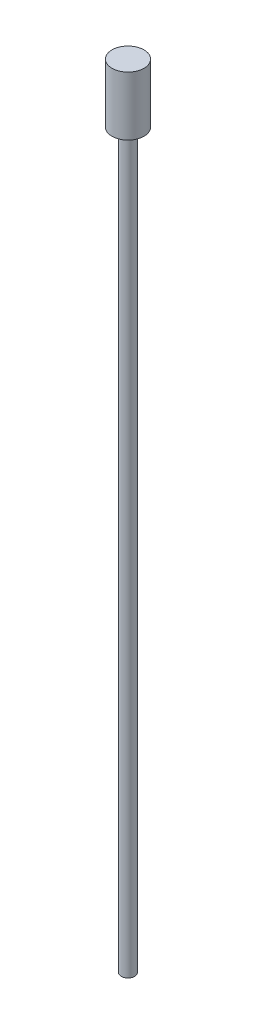
ISO-10303-21;
HEADER;
FILE_DESCRIPTION(('STEP AP214'),'2;1');
FILE_NAME('part.step','',(''),(''),'','','');
FILE_SCHEMA(('AUTOMOTIVE_DESIGN { 1 0 10303 214 1 1 1 1 }'));
ENDSEC;
DATA;
#1=APPLICATION_CONTEXT('core data for automotive mechanical design processes');
#2=APPLICATION_PROTOCOL_DEFINITION('international standard','automotive_design',2000,#1);
#3=PRODUCT_CONTEXT('',#1,'mechanical');
#4=PRODUCT('Part','Part','',(#3));
#5=PRODUCT_RELATED_PRODUCT_CATEGORY('part','',(#4));
#6=PRODUCT_DEFINITION_FORMATION('','',#4);
#7=PRODUCT_DEFINITION_CONTEXT('part definition',#1,'design');
#8=PRODUCT_DEFINITION('design','',#6,#7);
#9=PRODUCT_DEFINITION_SHAPE('','',#8);
#10=(LENGTH_UNIT() NAMED_UNIT(*) SI_UNIT(.MILLI.,.METRE.));
#11=(NAMED_UNIT(*) PLANE_ANGLE_UNIT() SI_UNIT($,.RADIAN.));
#12=(NAMED_UNIT(*) SI_UNIT($,.STERADIAN.) SOLID_ANGLE_UNIT());
#13=UNCERTAINTY_MEASURE_WITH_UNIT(LENGTH_MEASURE(1.E-05),#10,'distance_accuracy_value','');
#14=(GEOMETRIC_REPRESENTATION_CONTEXT(3) GLOBAL_UNCERTAINTY_ASSIGNED_CONTEXT((#13)) GLOBAL_UNIT_ASSIGNED_CONTEXT((#10,
#11,#12)) REPRESENTATION_CONTEXT('',''));
#15=CARTESIAN_POINT('',(0.,0.,0.));
#16=DIRECTION('',(0.,0.,1.));
#17=DIRECTION('',(1.,0.,0.));
#18=AXIS2_PLACEMENT_3D('',#15,#16,#17);
#19=CARTESIAN_POINT('',(0.,435.,0.));
#20=DIRECTION('',(0.,-1.,0.));
#21=DIRECTION('',(0.,0.,-1.));
#22=AXIS2_PLACEMENT_3D('',#19,#20,#21);
#23=CYLINDRICAL_SURFACE('',#22,4.);
#24=CARTESIAN_POINT('',(0.,435.,0.));
#25=DIRECTION('',(0.,1.,0.));
#26=DIRECTION('',(0.,0.,1.));
#27=AXIS2_PLACEMENT_3D('',#24,#25,#26);
#28=CIRCLE('',#27,4.);
#29=CARTESIAN_POINT('',(0.,435.,-4.));
#30=VERTEX_POINT('',#29);
#31=EDGE_CURVE('E10',#30,#30,#28,.T.);
#32=CARTESIAN_POINT('',(0.,0.,0.));
#33=DIRECTION('',(0.,1.,0.));
#34=DIRECTION('',(0.,0.,1.));
#35=AXIS2_PLACEMENT_3D('',#32,#33,#34);
#36=CIRCLE('',#35,4.);
#37=CARTESIAN_POINT('',(0.,0.,-4.));
#38=VERTEX_POINT('',#37);
#39=EDGE_CURVE('E40',#38,#38,#36,.T.);
#40=CARTESIAN_POINT('',(0.,435.,-4.));
#41=CARTESIAN_POINT('',(0.,430.46875,-4.));
#42=CARTESIAN_POINT('',(0.,425.9375,-4.));
#43=CARTESIAN_POINT('',(0.,416.875,-4.));
#44=CARTESIAN_POINT('',(0.,412.34375,-4.));
#45=CARTESIAN_POINT('',(0.,403.28125,-4.));
#46=CARTESIAN_POINT('',(0.,398.75,-4.));
#47=CARTESIAN_POINT('',(0.,389.6875,-4.));
#48=CARTESIAN_POINT('',(0.,385.15625,-4.));
#49=CARTESIAN_POINT('',(0.,376.09375,-4.));
#50=CARTESIAN_POINT('',(0.,371.5625,-4.));
#51=CARTESIAN_POINT('',(0.,362.5,-4.));
#52=CARTESIAN_POINT('',(0.,357.96875,-4.));
#53=CARTESIAN_POINT('',(0.,348.90625,-4.));
#54=CARTESIAN_POINT('',(0.,344.375,-4.));
#55=CARTESIAN_POINT('',(0.,335.3125,-4.));
#56=CARTESIAN_POINT('',(0.,330.78125,-4.));
#57=CARTESIAN_POINT('',(0.,321.71875,-4.));
#58=CARTESIAN_POINT('',(0.,317.1875,-4.));
#59=CARTESIAN_POINT('',(0.,308.125,-4.));
#60=CARTESIAN_POINT('',(0.,303.59375,-4.));
#61=CARTESIAN_POINT('',(0.,294.53125,-4.));
#62=CARTESIAN_POINT('',(0.,290.,-4.));
#63=CARTESIAN_POINT('',(0.,280.9375,-4.));
#64=CARTESIAN_POINT('',(0.,276.40625,-4.));
#65=CARTESIAN_POINT('',(0.,267.34375,-4.));
#66=CARTESIAN_POINT('',(0.,262.8125,-4.));
#67=CARTESIAN_POINT('',(0.,253.75,-4.));
#68=CARTESIAN_POINT('',(0.,249.21875,-4.));
#69=CARTESIAN_POINT('',(0.,240.15625,-4.));
#70=CARTESIAN_POINT('',(0.,235.625,-4.));
#71=CARTESIAN_POINT('',(0.,226.5625,-4.));
#72=CARTESIAN_POINT('',(0.,222.03125,-4.));
#73=CARTESIAN_POINT('',(0.,212.96875,-4.));
#74=CARTESIAN_POINT('',(0.,208.4375,-4.));
#75=CARTESIAN_POINT('',(0.,199.375,-4.));
#76=CARTESIAN_POINT('',(0.,194.84375,-4.));
#77=CARTESIAN_POINT('',(0.,185.78125,-4.));
#78=CARTESIAN_POINT('',(0.,181.25,-4.));
#79=CARTESIAN_POINT('',(0.,172.1875,-4.));
#80=CARTESIAN_POINT('',(0.,167.65625,-4.));
#81=CARTESIAN_POINT('',(0.,158.59375,-4.));
#82=CARTESIAN_POINT('',(0.,154.0625,-4.));
#83=CARTESIAN_POINT('',(0.,145.,-4.));
#84=CARTESIAN_POINT('',(0.,140.46875,-4.));
#85=CARTESIAN_POINT('',(0.,131.40625,-4.));
#86=CARTESIAN_POINT('',(0.,126.875,-4.));
#87=CARTESIAN_POINT('',(0.,117.8125,-4.));
#88=CARTESIAN_POINT('',(0.,113.28125,-4.));
#89=CARTESIAN_POINT('',(0.,104.21875,-4.));
#90=CARTESIAN_POINT('',(0.,99.6875,-4.));
#91=CARTESIAN_POINT('',(0.,90.625,-4.));
#92=CARTESIAN_POINT('',(0.,86.09375,-4.));
#93=CARTESIAN_POINT('',(0.,77.03125,-4.));
#94=CARTESIAN_POINT('',(0.,72.5,-4.));
#95=CARTESIAN_POINT('',(0.,63.4375,-4.));
#96=CARTESIAN_POINT('',(0.,58.90625,-4.));
#97=CARTESIAN_POINT('',(0.,49.84375,-4.));
#98=CARTESIAN_POINT('',(0.,45.3125,-4.));
#99=CARTESIAN_POINT('',(0.,36.25,-4.));
#100=CARTESIAN_POINT('',(0.,31.71875,-4.));
#101=CARTESIAN_POINT('',(0.,22.65625,-4.));
#102=CARTESIAN_POINT('',(0.,18.125,-4.));
#103=CARTESIAN_POINT('',(0.,9.06250000000001,-4.));
#104=CARTESIAN_POINT('',(0.,4.53125,-4.));
#105=CARTESIAN_POINT('',(0.,0.,-4.));
#106=B_SPLINE_CURVE_WITH_KNOTS('',3,(#40,#41,#42,#43,#44,#45,#46,#47,#48,#49,#50,#51,#52,#53,
#54,#55,#56,#57,#58,#59,#60,#61,#62,#63,#64,#65,#66,#67,#68,#69,#70,#71,#72,#73,#74,#75,#76,#77,
#78,#79,#80,#81,#82,#83,#84,#85,#86,#87,#88,#89,#90,#91,#92,#93,#94,#95,#96,#97,#98,#99,#100,
#101,#102,#103,#104,#105),.UNSPECIFIED.,.F.,.F.,(4,2,2,2,2,2,2,2,2,2,2,2,2,2,2,2,2,2,2,2,2,2,2,
2,2,2,2,2,2,2,2,2,4),(0.,13.59375,27.1875,40.78125,54.375,67.96875,81.5625,95.15625,108.75,
122.34375,135.9375,149.53125,163.125,176.71875,190.3125,203.90625,217.5,231.09375,244.6875,
258.28125,271.875,285.46875,299.0625,312.65625,326.25,339.84375,353.4375,367.03125,380.625,
394.21875,407.8125,421.40625,435.),.UNSPECIFIED.);
#107=EDGE_CURVE('BSEAM37',#30,#38,#106,.T.);
#108=ORIENTED_EDGE('',*,*,#31,.F.);
#109=ORIENTED_EDGE('',*,*,#39,.T.);
#110=ORIENTED_EDGE('',*,*,#107,.T.);
#111=ORIENTED_EDGE('',*,*,#107,.F.);
#112=EDGE_LOOP('',(#108,#110,#109,#111));
#113=FACE_BOUND('',#112,.T.);
#114=ADVANCED_FACE('F37',(#113),#23,.T.);
#115=CARTESIAN_POINT('',(0.,0.,0.));
#116=DIRECTION('',(0.,1.,0.));
#117=DIRECTION('',(0.,0.,1.));
#118=AXIS2_PLACEMENT_3D('',#115,#116,#117);
#119=PLANE('',#118);
#120=ORIENTED_EDGE('',*,*,#39,.F.);
#121=EDGE_LOOP('',(#120));
#122=FACE_BOUND('',#121,.T.);
#123=ADVANCED_FACE('F60',(#122),#119,.F.);
#124=CARTESIAN_POINT('',(0.,470.,0.));
#125=DIRECTION('',(0.,-1.,0.));
#126=DIRECTION('',(0.,0.,-1.));
#127=AXIS2_PLACEMENT_3D('',#124,#125,#126);
#128=CYLINDRICAL_SURFACE('',#127,9.5);
#129=CARTESIAN_POINT('',(0.,470.,0.));
#130=DIRECTION('',(0.,1.,0.));
#131=DIRECTION('',(0.,0.,1.));
#132=AXIS2_PLACEMENT_3D('',#129,#130,#131);
#133=CIRCLE('',#132,9.5);
#134=CARTESIAN_POINT('',(0.,470.,9.5));
#135=VERTEX_POINT('',#134);
#136=EDGE_CURVE('E47',#135,#135,#133,.T.);
#137=ORIENTED_EDGE('',*,*,#136,.F.);
#138=EDGE_LOOP('',(#137));
#139=FACE_BOUND('',#138,.T.);
#140=CARTESIAN_POINT('',(0.,435.,0.));
#141=DIRECTION('',(0.,1.,0.));
#142=DIRECTION('',(0.,0.,1.));
#143=AXIS2_PLACEMENT_3D('',#140,#141,#142);
#144=CIRCLE('',#143,9.5);
#145=CARTESIAN_POINT('',(0.,435.,9.5));
#146=VERTEX_POINT('',#145);
#147=EDGE_CURVE('E49',#146,#146,#144,.T.);
#148=ORIENTED_EDGE('',*,*,#147,.T.);
#149=EDGE_LOOP('',(#148));
#150=FACE_BOUND('',#149,.T.);
#151=ADVANCED_FACE('F57',(#139,#150),#128,.T.);
#152=CARTESIAN_POINT('',(0.,470.,0.));
#153=DIRECTION('',(0.,1.,0.));
#154=DIRECTION('',(0.,0.,1.));
#155=AXIS2_PLACEMENT_3D('',#152,#153,#154);
#156=PLANE('',#155);
#157=ORIENTED_EDGE('',*,*,#136,.T.);
#158=EDGE_LOOP('',(#157));
#159=FACE_BOUND('',#158,.T.);
#160=ADVANCED_FACE('F55',(#159),#156,.T.);
#161=CARTESIAN_POINT('',(0.,435.,0.));
#162=DIRECTION('',(0.,1.,0.));
#163=DIRECTION('',(0.,0.,1.));
#164=AXIS2_PLACEMENT_3D('',#161,#162,#163);
#165=PLANE('',#164);
#166=ORIENTED_EDGE('',*,*,#31,.T.);
#167=EDGE_LOOP('',(#166));
#168=FACE_BOUND('',#167,.T.);
#169=ORIENTED_EDGE('',*,*,#147,.F.);
#170=EDGE_LOOP('',(#169));
#171=FACE_BOUND('',#170,.T.);
#172=ADVANCED_FACE('F64',(#168,#171),#165,.F.);
#173=CLOSED_SHELL('',(#114,#123,#151,#160,#172));
#174=MANIFOLD_SOLID_BREP('B2',#173);
#175=ADVANCED_BREP_SHAPE_REPRESENTATION('',(#18,#174),#14);
#176=SHAPE_DEFINITION_REPRESENTATION(#9,#175);
ENDSEC;
END-ISO-10303-21;
